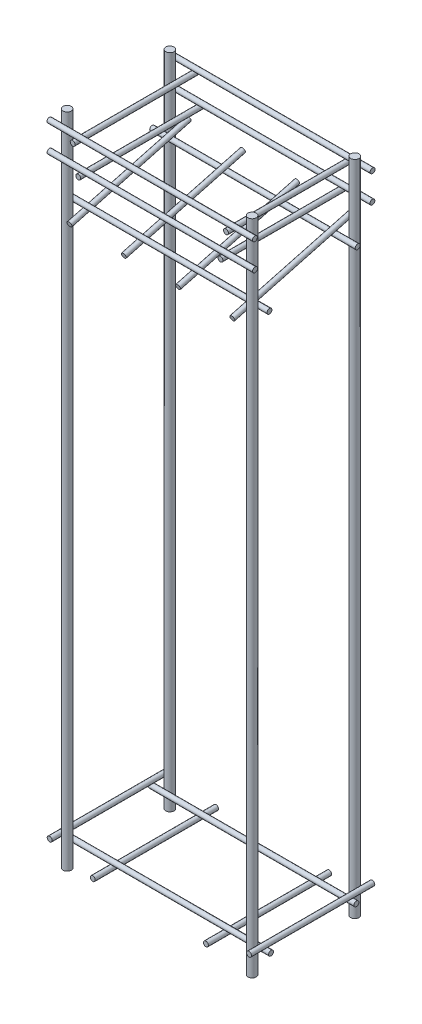
ISO-10303-21;
HEADER;
FILE_DESCRIPTION(('STEP AP214'),'2;1');
FILE_NAME('part.step','',(''),(''),'','','');
FILE_SCHEMA(('AUTOMOTIVE_DESIGN { 1 0 10303 214 1 1 1 1 }'));
ENDSEC;
DATA;
#1=APPLICATION_CONTEXT('core data for automotive mechanical design processes');
#2=APPLICATION_PROTOCOL_DEFINITION('international standard','automotive_design',2000,#1);
#3=PRODUCT_CONTEXT('',#1,'mechanical');
#4=PRODUCT('Part','Part','',(#3));
#5=PRODUCT_RELATED_PRODUCT_CATEGORY('part','',(#4));
#6=PRODUCT_DEFINITION_FORMATION('','',#4);
#7=PRODUCT_DEFINITION_CONTEXT('part definition',#1,'design');
#8=PRODUCT_DEFINITION('design','',#6,#7);
#9=PRODUCT_DEFINITION_SHAPE('','',#8);
#10=(LENGTH_UNIT() NAMED_UNIT(*) SI_UNIT(.MILLI.,.METRE.));
#11=(NAMED_UNIT(*) PLANE_ANGLE_UNIT() SI_UNIT($,.RADIAN.));
#12=(NAMED_UNIT(*) SI_UNIT($,.STERADIAN.) SOLID_ANGLE_UNIT());
#13=UNCERTAINTY_MEASURE_WITH_UNIT(LENGTH_MEASURE(1.E-05),#10,'distance_accuracy_value','');
#14=(GEOMETRIC_REPRESENTATION_CONTEXT(3) GLOBAL_UNCERTAINTY_ASSIGNED_CONTEXT((#13)) GLOBAL_UNIT_ASSIGNED_CONTEXT((#10,
#11,#12)) REPRESENTATION_CONTEXT('',''));
#15=CARTESIAN_POINT('',(0.,0.,0.));
#16=DIRECTION('',(0.,0.,1.));
#17=DIRECTION('',(1.,0.,0.));
#18=AXIS2_PLACEMENT_3D('',#15,#16,#17);
#19=CARTESIAN_POINT('',(196.,1378.33156675164,144.117162802677));
#20=DIRECTION('',(0.,-0.258819045102522,0.965925826289068));
#21=DIRECTION('',(0.,-0.965925826289068,-0.258819045102522));
#22=AXIS2_PLACEMENT_3D('',#19,#20,#21);
#23=PLANE('',#22);
#24=CARTESIAN_POINT('',(196.,1378.33156675164,144.117162802677));
#25=DIRECTION('',(0.,0.258819045102522,-0.965925826289068));
#26=DIRECTION('',(0.,0.965925826289068,0.258819045102522));
#27=AXIS2_PLACEMENT_3D('',#24,#25,#26);
#28=CIRCLE('',#27,6.00000000000024);
#29=CARTESIAN_POINT('',(196.,1384.12712170938,145.670077073292));
#30=VERTEX_POINT('',#29);
#31=EDGE_CURVE('E11',#30,#30,#28,.T.);
#32=ORIENTED_EDGE('',*,*,#31,.F.);
#33=EDGE_LOOP('',(#32));
#34=FACE_BOUND('',#33,.T.);
#35=ADVANCED_FACE('F48',(#34),#23,.T.);
#36=CARTESIAN_POINT('',(196.,1455.9772802824,-145.660585084044));
#37=DIRECTION('',(0.,0.258819045102522,-0.965925826289068));
#38=DIRECTION('',(0.,0.965925826289068,0.258819045102522));
#39=AXIS2_PLACEMENT_3D('',#36,#37,#38);
#40=CYLINDRICAL_SURFACE('',#39,6.00000000000012);
#41=ORIENTED_EDGE('',*,*,#31,.T.);
#42=EDGE_LOOP('',(#41));
#43=FACE_BOUND('',#42,.T.);
#44=CARTESIAN_POINT('',(196.,1455.9772802824,-145.660585084044));
#45=DIRECTION('',(0.,0.258819045102522,-0.965925826289068));
#46=DIRECTION('',(0.,0.965925826289068,0.258819045102522));
#47=AXIS2_PLACEMENT_3D('',#44,#45,#46);
#48=CIRCLE('',#47,6.00000000000004);
#49=CARTESIAN_POINT('',(196.,1461.77283524014,-144.107670813428));
#50=VERTEX_POINT('',#49);
#51=EDGE_CURVE('E54',#50,#50,#48,.T.);
#52=ORIENTED_EDGE('',*,*,#51,.F.);
#53=EDGE_LOOP('',(#52));
#54=FACE_BOUND('',#53,.T.);
#55=ADVANCED_FACE('F62',(#43,#54),#40,.T.);
#56=CARTESIAN_POINT('',(196.,1455.9772802824,-145.660585084044));
#57=DIRECTION('',(0.,0.258819045102522,-0.965925826289068));
#58=DIRECTION('',(0.,0.965925826289068,0.258819045102522));
#59=AXIS2_PLACEMENT_3D('',#56,#57,#58);
#60=PLANE('',#59);
#61=ORIENTED_EDGE('',*,*,#51,.T.);
#62=EDGE_LOOP('',(#61));
#63=FACE_BOUND('',#62,.T.);
#64=ADVANCED_FACE('F60',(#63),#60,.T.);
#65=CLOSED_SHELL('',(#35,#55,#64));
#66=MANIFOLD_SOLID_BREP('B2',#65);
#67=CARTESIAN_POINT('',(64.0000000000001,1378.33156675164,144.117162802677));
#68=DIRECTION('',(0.,-0.258819045102522,0.965925826289068));
#69=DIRECTION('',(0.,-0.965925826289068,-0.258819045102522));
#70=AXIS2_PLACEMENT_3D('',#67,#68,#69);
#71=PLANE('',#70);
#72=CARTESIAN_POINT('',(64.0000000000001,1378.33156675164,144.117162802677));
#73=DIRECTION('',(0.,0.258819045102522,-0.965925826289068));
#74=DIRECTION('',(0.,0.965925826289068,0.258819045102522));
#75=AXIS2_PLACEMENT_3D('',#72,#73,#74);
#76=CIRCLE('',#75,6.00000000000024);
#77=CARTESIAN_POINT('',(64.0000000000001,1384.12712170938,145.670077073292));
#78=VERTEX_POINT('',#77);
#79=EDGE_CURVE('E47',#78,#78,#76,.T.);
#80=ORIENTED_EDGE('',*,*,#79,.F.);
#81=EDGE_LOOP('',(#80));
#82=FACE_BOUND('',#81,.T.);
#83=ADVANCED_FACE('F97',(#82),#71,.T.);
#84=CARTESIAN_POINT('',(64.0000000000001,1455.9772802824,-145.660585084044));
#85=DIRECTION('',(0.,0.258819045102522,-0.965925826289068));
#86=DIRECTION('',(0.,0.965925826289068,0.258819045102522));
#87=AXIS2_PLACEMENT_3D('',#84,#85,#86);
#88=CYLINDRICAL_SURFACE('',#87,6.00000000000012);
#89=ORIENTED_EDGE('',*,*,#79,.T.);
#90=EDGE_LOOP('',(#89));
#91=FACE_BOUND('',#90,.T.);
#92=CARTESIAN_POINT('',(64.0000000000001,1455.9772802824,-145.660585084044));
#93=DIRECTION('',(0.,0.258819045102522,-0.965925826289068));
#94=DIRECTION('',(0.,0.965925826289068,0.258819045102522));
#95=AXIS2_PLACEMENT_3D('',#92,#93,#94);
#96=CIRCLE('',#95,6.00000000000004);
#97=CARTESIAN_POINT('',(64.0000000000001,1461.77283524014,-144.107670813428));
#98=VERTEX_POINT('',#97);
#99=EDGE_CURVE('E103',#98,#98,#96,.T.);
#100=ORIENTED_EDGE('',*,*,#99,.F.);
#101=EDGE_LOOP('',(#100));
#102=FACE_BOUND('',#101,.T.);
#103=ADVANCED_FACE('F111',(#91,#102),#88,.T.);
#104=CARTESIAN_POINT('',(64.0000000000001,1455.9772802824,-145.660585084044));
#105=DIRECTION('',(0.,0.258819045102522,-0.965925826289068));
#106=DIRECTION('',(0.,0.965925826289068,0.258819045102522));
#107=AXIS2_PLACEMENT_3D('',#104,#105,#106);
#108=PLANE('',#107);
#109=ORIENTED_EDGE('',*,*,#99,.T.);
#110=EDGE_LOOP('',(#109));
#111=FACE_BOUND('',#110,.T.);
#112=ADVANCED_FACE('F109',(#111),#108,.T.);
#113=CLOSED_SHELL('',(#83,#103,#112));
#114=MANIFOLD_SOLID_BREP('B6',#113);
#115=CARTESIAN_POINT('',(-67.9999999999999,1378.33156675164,144.117162802677));
#116=DIRECTION('',(0.,-0.258819045102522,0.965925826289068));
#117=DIRECTION('',(0.,-0.965925826289068,-0.258819045102522));
#118=AXIS2_PLACEMENT_3D('',#115,#116,#117);
#119=PLANE('',#118);
#120=CARTESIAN_POINT('',(-67.9999999999999,1378.33156675164,144.117162802677));
#121=DIRECTION('',(0.,0.258819045102522,-0.965925826289068));
#122=DIRECTION('',(0.,0.965925826289068,0.258819045102522));
#123=AXIS2_PLACEMENT_3D('',#120,#121,#122);
#124=CIRCLE('',#123,6.00000000000024);
#125=CARTESIAN_POINT('',(-67.9999999999999,1384.12712170938,145.670077073292));
#126=VERTEX_POINT('',#125);
#127=EDGE_CURVE('E96',#126,#126,#124,.T.);
#128=ORIENTED_EDGE('',*,*,#127,.F.);
#129=EDGE_LOOP('',(#128));
#130=FACE_BOUND('',#129,.T.);
#131=ADVANCED_FACE('F146',(#130),#119,.T.);
#132=CARTESIAN_POINT('',(-67.9999999999999,1455.9772802824,-145.660585084044));
#133=DIRECTION('',(0.,0.258819045102522,-0.965925826289068));
#134=DIRECTION('',(0.,0.965925826289068,0.258819045102522));
#135=AXIS2_PLACEMENT_3D('',#132,#133,#134);
#136=CYLINDRICAL_SURFACE('',#135,6.00000000000012);
#137=ORIENTED_EDGE('',*,*,#127,.T.);
#138=EDGE_LOOP('',(#137));
#139=FACE_BOUND('',#138,.T.);
#140=CARTESIAN_POINT('',(-67.9999999999999,1455.9772802824,-145.660585084044));
#141=DIRECTION('',(0.,0.258819045102522,-0.965925826289068));
#142=DIRECTION('',(0.,0.965925826289068,0.258819045102522));
#143=AXIS2_PLACEMENT_3D('',#140,#141,#142);
#144=CIRCLE('',#143,6.00000000000004);
#145=CARTESIAN_POINT('',(-67.9999999999999,1461.77283524014,-144.107670813428));
#146=VERTEX_POINT('',#145);
#147=EDGE_CURVE('E152',#146,#146,#144,.T.);
#148=ORIENTED_EDGE('',*,*,#147,.F.);
#149=EDGE_LOOP('',(#148));
#150=FACE_BOUND('',#149,.T.);
#151=ADVANCED_FACE('F160',(#139,#150),#136,.T.);
#152=CARTESIAN_POINT('',(-67.9999999999999,1455.9772802824,-145.660585084044));
#153=DIRECTION('',(0.,0.258819045102522,-0.965925826289068));
#154=DIRECTION('',(0.,0.965925826289068,0.258819045102522));
#155=AXIS2_PLACEMENT_3D('',#152,#153,#154);
#156=PLANE('',#155);
#157=ORIENTED_EDGE('',*,*,#147,.T.);
#158=EDGE_LOOP('',(#157));
#159=FACE_BOUND('',#158,.T.);
#160=ADVANCED_FACE('F158',(#159),#156,.T.);
#161=CLOSED_SHELL('',(#131,#151,#160));
#162=MANIFOLD_SOLID_BREP('B42',#161);
#163=CARTESIAN_POINT('',(-200.,1378.33156675164,144.117162802677));
#164=DIRECTION('',(0.,-0.258819045102522,0.965925826289068));
#165=DIRECTION('',(0.,-0.965925826289068,-0.258819045102522));
#166=AXIS2_PLACEMENT_3D('',#163,#164,#165);
#167=PLANE('',#166);
#168=CARTESIAN_POINT('',(-200.,1378.33156675164,144.117162802677));
#169=DIRECTION('',(0.,0.258819045102522,-0.965925826289068));
#170=DIRECTION('',(0.,0.965925826289068,0.258819045102522));
#171=AXIS2_PLACEMENT_3D('',#168,#169,#170);
#172=CIRCLE('',#171,6.00000000000024);
#173=CARTESIAN_POINT('',(-200.,1384.12712170938,145.670077073292));
#174=VERTEX_POINT('',#173);
#175=EDGE_CURVE('E201',#174,#174,#172,.T.);
#176=ORIENTED_EDGE('',*,*,#175,.F.);
#177=EDGE_LOOP('',(#176));
#178=FACE_BOUND('',#177,.T.);
#179=ADVANCED_FACE('F195',(#178),#167,.T.);
#180=CARTESIAN_POINT('',(-200.,1455.9772802824,-145.660585084044));
#181=DIRECTION('',(0.,0.258819045102522,-0.965925826289068));
#182=DIRECTION('',(0.,0.965925826289068,0.258819045102522));
#183=AXIS2_PLACEMENT_3D('',#180,#181,#182);
#184=PLANE('',#183);
#185=CARTESIAN_POINT('',(-200.,1455.9772802824,-145.660585084044));
#186=DIRECTION('',(0.,0.258819045102522,-0.965925826289068));
#187=DIRECTION('',(0.,0.965925826289068,0.258819045102522));
#188=AXIS2_PLACEMENT_3D('',#185,#186,#187);
#189=CIRCLE('',#188,6.00000000000004);
#190=CARTESIAN_POINT('',(-200.,1461.77283524014,-144.107670813428));
#191=VERTEX_POINT('',#190);
#192=EDGE_CURVE('E145',#191,#191,#189,.T.);
#193=ORIENTED_EDGE('',*,*,#192,.T.);
#194=EDGE_LOOP('',(#193));
#195=FACE_BOUND('',#194,.T.);
#196=ADVANCED_FACE('F211',(#195),#184,.T.);
#197=CARTESIAN_POINT('',(-200.,1455.9772802824,-145.660585084044));
#198=DIRECTION('',(0.,0.258819045102522,-0.965925826289068));
#199=DIRECTION('',(0.,0.965925826289068,0.258819045102522));
#200=AXIS2_PLACEMENT_3D('',#197,#198,#199);
#201=CYLINDRICAL_SURFACE('',#200,6.00000000000012);
#202=ORIENTED_EDGE('',*,*,#175,.T.);
#203=EDGE_LOOP('',(#202));
#204=FACE_BOUND('',#203,.T.);
#205=ORIENTED_EDGE('',*,*,#192,.F.);
#206=EDGE_LOOP('',(#205));
#207=FACE_BOUND('',#206,.T.);
#208=ADVANCED_FACE('F207',(#204,#207),#201,.T.);
#209=CLOSED_SHELL('',(#179,#196,#208));
#210=MANIFOLD_SOLID_BREP('B91',#209);
#211=CARTESIAN_POINT('',(250.,1430.5071877385,-106.955510048629));
#212=DIRECTION('',(-1.,0.,0.));
#213=DIRECTION('',(0.,0.,1.));
#214=AXIS2_PLACEMENT_3D('',#211,#212,#213);
#215=CYLINDRICAL_SURFACE('',#214,6.);
#216=CARTESIAN_POINT('',(250.,1430.5071877385,-106.955510048629));
#217=DIRECTION('',(1.,0.,0.));
#218=DIRECTION('',(0.,0.,1.));
#219=AXIS2_PLACEMENT_3D('',#216,#217,#218);
#220=CIRCLE('',#219,6.);
#221=CARTESIAN_POINT('',(250.,1430.5071877385,-100.955510048629));
#222=VERTEX_POINT('',#221);
#223=EDGE_CURVE('E248',#222,#222,#220,.T.);
#224=ORIENTED_EDGE('',*,*,#223,.F.);
#225=EDGE_LOOP('',(#224));
#226=FACE_BOUND('',#225,.T.);
#227=CARTESIAN_POINT('',(-250.,1430.5071877385,-106.955510048629));
#228=DIRECTION('',(1.,0.,0.));
#229=DIRECTION('',(0.,0.,1.));
#230=AXIS2_PLACEMENT_3D('',#227,#228,#229);
#231=CIRCLE('',#230,6.);
#232=CARTESIAN_POINT('',(-250.,1430.5071877385,-100.955510048629));
#233=VERTEX_POINT('',#232);
#234=EDGE_CURVE('E194',#233,#233,#231,.T.);
#235=ORIENTED_EDGE('',*,*,#234,.T.);
#236=EDGE_LOOP('',(#235));
#237=FACE_BOUND('',#236,.T.);
#238=ADVANCED_FACE('F244',(#226,#237),#215,.T.);
#239=CARTESIAN_POINT('',(250.,1430.5071877385,-106.955510048629));
#240=DIRECTION('',(-1.,0.,0.));
#241=DIRECTION('',(0.,0.,1.));
#242=AXIS2_PLACEMENT_3D('',#239,#240,#241);
#243=PLANE('',#242);
#244=ORIENTED_EDGE('',*,*,#223,.T.);
#245=EDGE_LOOP('',(#244));
#246=FACE_BOUND('',#245,.T.);
#247=ADVANCED_FACE('F246',(#246),#243,.F.);
#248=CARTESIAN_POINT('',(-250.,1430.5071877385,-106.955510048629));
#249=DIRECTION('',(-1.,0.,0.));
#250=DIRECTION('',(0.,0.,1.));
#251=AXIS2_PLACEMENT_3D('',#248,#249,#250);
#252=PLANE('',#251);
#253=ORIENTED_EDGE('',*,*,#234,.F.);
#254=EDGE_LOOP('',(#253));
#255=FACE_BOUND('',#254,.T.);
#256=ADVANCED_FACE('F263',(#255),#252,.T.);
#257=CLOSED_SHELL('',(#238,#247,#256));
#258=MANIFOLD_SOLID_BREP('B140',#257);
#259=CARTESIAN_POINT('',(250.,1401.92530520379,107.657826454038));
#260=DIRECTION('',(-1.,0.,0.));
#261=DIRECTION('',(0.,0.,1.));
#262=AXIS2_PLACEMENT_3D('',#259,#260,#261);
#263=CYLINDRICAL_SURFACE('',#262,6.);
#264=CARTESIAN_POINT('',(250.,1401.92530520379,107.657826454038));
#265=DIRECTION('',(1.,0.,0.));
#266=DIRECTION('',(0.,0.,-1.));
#267=AXIS2_PLACEMENT_3D('',#264,#265,#266);
#268=CIRCLE('',#267,6.);
#269=CARTESIAN_POINT('',(250.,1401.92530520379,101.657826454038));
#270=VERTEX_POINT('',#269);
#271=EDGE_CURVE('E243',#270,#270,#268,.T.);
#272=ORIENTED_EDGE('',*,*,#271,.F.);
#273=EDGE_LOOP('',(#272));
#274=FACE_BOUND('',#273,.T.);
#275=CARTESIAN_POINT('',(-250.,1401.92530520379,107.657826454038));
#276=DIRECTION('',(1.,0.,0.));
#277=DIRECTION('',(0.,0.,-1.));
#278=AXIS2_PLACEMENT_3D('',#275,#276,#277);
#279=CIRCLE('',#278,6.);
#280=CARTESIAN_POINT('',(-250.,1401.92530520379,101.657826454038));
#281=VERTEX_POINT('',#280);
#282=EDGE_CURVE('E296',#281,#281,#279,.T.);
#283=ORIENTED_EDGE('',*,*,#282,.T.);
#284=EDGE_LOOP('',(#283));
#285=FACE_BOUND('',#284,.T.);
#286=ADVANCED_FACE('F293',(#274,#285),#263,.T.);
#287=CARTESIAN_POINT('',(250.,1401.92530520379,107.657826454038));
#288=DIRECTION('',(1.,0.,0.));
#289=DIRECTION('',(0.,0.,-1.));
#290=AXIS2_PLACEMENT_3D('',#287,#288,#289);
#291=PLANE('',#290);
#292=ORIENTED_EDGE('',*,*,#271,.T.);
#293=EDGE_LOOP('',(#292));
#294=FACE_BOUND('',#293,.T.);
#295=ADVANCED_FACE('F308',(#294),#291,.T.);
#296=CARTESIAN_POINT('',(-250.,1401.92530520379,107.657826454038));
#297=DIRECTION('',(1.,0.,0.));
#298=DIRECTION('',(0.,0.,-1.));
#299=AXIS2_PLACEMENT_3D('',#296,#297,#298);
#300=PLANE('',#299);
#301=ORIENTED_EDGE('',*,*,#282,.F.);
#302=EDGE_LOOP('',(#301));
#303=FACE_BOUND('',#302,.T.);
#304=ADVANCED_FACE('F306',(#303),#300,.F.);
#305=CLOSED_SHELL('',(#286,#295,#304));
#306=MANIFOLD_SOLID_BREP('B189',#305);
#307=CARTESIAN_POINT('',(173.,1494.54464611904,150.));
#308=DIRECTION('',(0.,0.,-1.));
#309=DIRECTION('',(-1.,0.,0.));
#310=AXIS2_PLACEMENT_3D('',#307,#308,#309);
#311=CYLINDRICAL_SURFACE('',#310,6.00000000000002);
#312=CARTESIAN_POINT('',(173.,1494.54464611904,150.));
#313=DIRECTION('',(0.,0.,1.));
#314=DIRECTION('',(-1.,0.,0.));
#315=AXIS2_PLACEMENT_3D('',#312,#313,#314);
#316=CIRCLE('',#315,6.00000000000002);
#317=CARTESIAN_POINT('',(167.,1494.54464611904,150.));
#318=VERTEX_POINT('',#317);
#319=EDGE_CURVE('E346',#318,#318,#316,.T.);
#320=ORIENTED_EDGE('',*,*,#319,.F.);
#321=EDGE_LOOP('',(#320));
#322=FACE_BOUND('',#321,.T.);
#323=CARTESIAN_POINT('',(173.,1494.54464611904,-150.));
#324=DIRECTION('',(0.,0.,1.));
#325=DIRECTION('',(-1.,0.,0.));
#326=AXIS2_PLACEMENT_3D('',#323,#324,#325);
#327=CIRCLE('',#326,6.00000000000002);
#328=CARTESIAN_POINT('',(167.,1494.54464611904,-150.));
#329=VERTEX_POINT('',#328);
#330=EDGE_CURVE('E292',#329,#329,#327,.T.);
#331=ORIENTED_EDGE('',*,*,#330,.T.);
#332=EDGE_LOOP('',(#331));
#333=FACE_BOUND('',#332,.T.);
#334=ADVANCED_FACE('F342',(#322,#333),#311,.T.);
#335=CARTESIAN_POINT('',(173.,1494.54464611904,150.));
#336=DIRECTION('',(0.,0.,-1.));
#337=DIRECTION('',(-1.,0.,0.));
#338=AXIS2_PLACEMENT_3D('',#335,#336,#337);
#339=PLANE('',#338);
#340=ORIENTED_EDGE('',*,*,#319,.T.);
#341=EDGE_LOOP('',(#340));
#342=FACE_BOUND('',#341,.T.);
#343=ADVANCED_FACE('F344',(#342),#339,.F.);
#344=CARTESIAN_POINT('',(173.,1494.54464611904,-150.));
#345=DIRECTION('',(0.,0.,-1.));
#346=DIRECTION('',(-1.,0.,0.));
#347=AXIS2_PLACEMENT_3D('',#344,#345,#346);
#348=PLANE('',#347);
#349=ORIENTED_EDGE('',*,*,#330,.F.);
#350=EDGE_LOOP('',(#349));
#351=FACE_BOUND('',#350,.T.);
#352=ADVANCED_FACE('F361',(#351),#348,.T.);
#353=CLOSED_SHELL('',(#334,#343,#352));
#354=MANIFOLD_SOLID_BREP('B238',#353);
#355=CARTESIAN_POINT('',(-173.,1494.54464611904,150.));
#356=DIRECTION('',(0.,0.,-1.));
#357=DIRECTION('',(-1.,0.,0.));
#358=AXIS2_PLACEMENT_3D('',#355,#356,#357);
#359=CYLINDRICAL_SURFACE('',#358,6.00000000000002);
#360=CARTESIAN_POINT('',(-173.,1494.54464611904,150.));
#361=DIRECTION('',(0.,0.,1.));
#362=DIRECTION('',(1.,0.,0.));
#363=AXIS2_PLACEMENT_3D('',#360,#361,#362);
#364=CIRCLE('',#363,6.00000000000002);
#365=CARTESIAN_POINT('',(-167.,1494.54464611904,150.));
#366=VERTEX_POINT('',#365);
#367=EDGE_CURVE('E341',#366,#366,#364,.T.);
#368=ORIENTED_EDGE('',*,*,#367,.F.);
#369=EDGE_LOOP('',(#368));
#370=FACE_BOUND('',#369,.T.);
#371=CARTESIAN_POINT('',(-173.,1494.54464611904,-150.));
#372=DIRECTION('',(0.,0.,1.));
#373=DIRECTION('',(1.,0.,0.));
#374=AXIS2_PLACEMENT_3D('',#371,#372,#373);
#375=CIRCLE('',#374,6.00000000000002);
#376=CARTESIAN_POINT('',(-167.,1494.54464611904,-150.));
#377=VERTEX_POINT('',#376);
#378=EDGE_CURVE('E394',#377,#377,#375,.T.);
#379=ORIENTED_EDGE('',*,*,#378,.T.);
#380=EDGE_LOOP('',(#379));
#381=FACE_BOUND('',#380,.T.);
#382=ADVANCED_FACE('F391',(#370,#381),#359,.T.);
#383=CARTESIAN_POINT('',(-173.,1494.54464611904,150.));
#384=DIRECTION('',(0.,0.,1.));
#385=DIRECTION('',(1.,0.,0.));
#386=AXIS2_PLACEMENT_3D('',#383,#384,#385);
#387=PLANE('',#386);
#388=ORIENTED_EDGE('',*,*,#367,.T.);
#389=EDGE_LOOP('',(#388));
#390=FACE_BOUND('',#389,.T.);
#391=ADVANCED_FACE('F406',(#390),#387,.T.);
#392=CARTESIAN_POINT('',(-173.,1494.54464611904,-150.));
#393=DIRECTION('',(0.,0.,1.));
#394=DIRECTION('',(1.,0.,0.));
#395=AXIS2_PLACEMENT_3D('',#392,#393,#394);
#396=PLANE('',#395);
#397=ORIENTED_EDGE('',*,*,#378,.F.);
#398=EDGE_LOOP('',(#397));
#399=FACE_BOUND('',#398,.T.);
#400=ADVANCED_FACE('F404',(#399),#396,.F.);
#401=CLOSED_SHELL('',(#382,#391,#400));
#402=MANIFOLD_SOLID_BREP('B287',#401);
#403=CARTESIAN_POINT('',(250.,1506.80892711628,-142.693020426577));
#404=DIRECTION('',(-1.,0.,0.));
#405=DIRECTION('',(0.,0.,1.));
#406=AXIS2_PLACEMENT_3D('',#403,#404,#405);
#407=CYLINDRICAL_SURFACE('',#406,6.00000000000002);
#408=CARTESIAN_POINT('',(250.,1506.80892711628,-142.693020426577));
#409=DIRECTION('',(1.,0.,0.));
#410=DIRECTION('',(0.,0.,1.));
#411=AXIS2_PLACEMENT_3D('',#408,#409,#410);
#412=CIRCLE('',#411,6.00000000000002);
#413=CARTESIAN_POINT('',(250.,1506.80892711628,-136.693020426577));
#414=VERTEX_POINT('',#413);
#415=EDGE_CURVE('E444',#414,#414,#412,.T.);
#416=ORIENTED_EDGE('',*,*,#415,.F.);
#417=EDGE_LOOP('',(#416));
#418=FACE_BOUND('',#417,.T.);
#419=CARTESIAN_POINT('',(-250.,1506.80892711628,-142.693020426577));
#420=DIRECTION('',(1.,0.,0.));
#421=DIRECTION('',(0.,0.,1.));
#422=AXIS2_PLACEMENT_3D('',#419,#420,#421);
#423=CIRCLE('',#422,6.00000000000002);
#424=CARTESIAN_POINT('',(-250.,1506.80892711628,-136.693020426577));
#425=VERTEX_POINT('',#424);
#426=EDGE_CURVE('E390',#425,#425,#423,.T.);
#427=ORIENTED_EDGE('',*,*,#426,.T.);
#428=EDGE_LOOP('',(#427));
#429=FACE_BOUND('',#428,.T.);
#430=ADVANCED_FACE('F440',(#418,#429),#407,.T.);
#431=CARTESIAN_POINT('',(250.,1506.80892711628,-142.693020426577));
#432=DIRECTION('',(-1.,0.,0.));
#433=DIRECTION('',(0.,0.,1.));
#434=AXIS2_PLACEMENT_3D('',#431,#432,#433);
#435=PLANE('',#434);
#436=ORIENTED_EDGE('',*,*,#415,.T.);
#437=EDGE_LOOP('',(#436));
#438=FACE_BOUND('',#437,.T.);
#439=ADVANCED_FACE('F442',(#438),#435,.F.);
#440=CARTESIAN_POINT('',(-250.,1506.80892711628,-142.693020426577));
#441=DIRECTION('',(-1.,0.,0.));
#442=DIRECTION('',(0.,0.,1.));
#443=AXIS2_PLACEMENT_3D('',#440,#441,#442);
#444=PLANE('',#443);
#445=ORIENTED_EDGE('',*,*,#426,.F.);
#446=EDGE_LOOP('',(#445));
#447=FACE_BOUND('',#446,.T.);
#448=ADVANCED_FACE('F459',(#447),#444,.T.);
#449=CLOSED_SHELL('',(#430,#439,#448));
#450=MANIFOLD_SOLID_BREP('B336',#449);
#451=CARTESIAN_POINT('',(250.,1506.80892711628,142.693020426577));
#452=DIRECTION('',(-1.,0.,0.));
#453=DIRECTION('',(0.,0.,1.));
#454=AXIS2_PLACEMENT_3D('',#451,#452,#453);
#455=CYLINDRICAL_SURFACE('',#454,6.00000000000002);
#456=CARTESIAN_POINT('',(250.,1506.80892711628,142.693020426577));
#457=DIRECTION('',(1.,0.,0.));
#458=DIRECTION('',(0.,0.,-1.));
#459=AXIS2_PLACEMENT_3D('',#456,#457,#458);
#460=CIRCLE('',#459,6.00000000000002);
#461=CARTESIAN_POINT('',(250.,1506.80892711628,136.693020426577));
#462=VERTEX_POINT('',#461);
#463=EDGE_CURVE('E439',#462,#462,#460,.T.);
#464=ORIENTED_EDGE('',*,*,#463,.F.);
#465=EDGE_LOOP('',(#464));
#466=FACE_BOUND('',#465,.T.);
#467=CARTESIAN_POINT('',(-250.,1506.80892711628,142.693020426577));
#468=DIRECTION('',(1.,0.,0.));
#469=DIRECTION('',(0.,0.,-1.));
#470=AXIS2_PLACEMENT_3D('',#467,#468,#469);
#471=CIRCLE('',#470,6.00000000000002);
#472=CARTESIAN_POINT('',(-250.,1506.80892711628,136.693020426577));
#473=VERTEX_POINT('',#472);
#474=EDGE_CURVE('E492',#473,#473,#471,.T.);
#475=ORIENTED_EDGE('',*,*,#474,.T.);
#476=EDGE_LOOP('',(#475));
#477=FACE_BOUND('',#476,.T.);
#478=ADVANCED_FACE('F489',(#466,#477),#455,.T.);
#479=CARTESIAN_POINT('',(250.,1506.80892711628,142.693020426577));
#480=DIRECTION('',(1.,0.,0.));
#481=DIRECTION('',(0.,0.,-1.));
#482=AXIS2_PLACEMENT_3D('',#479,#480,#481);
#483=PLANE('',#482);
#484=ORIENTED_EDGE('',*,*,#463,.T.);
#485=EDGE_LOOP('',(#484));
#486=FACE_BOUND('',#485,.T.);
#487=ADVANCED_FACE('F504',(#486),#483,.T.);
#488=CARTESIAN_POINT('',(-250.,1506.80892711628,142.693020426577));
#489=DIRECTION('',(1.,0.,0.));
#490=DIRECTION('',(0.,0.,-1.));
#491=AXIS2_PLACEMENT_3D('',#488,#489,#490);
#492=PLANE('',#491);
#493=ORIENTED_EDGE('',*,*,#474,.F.);
#494=EDGE_LOOP('',(#493));
#495=FACE_BOUND('',#494,.T.);
#496=ADVANCED_FACE('F502',(#495),#492,.F.);
#497=CLOSED_SHELL('',(#478,#487,#496));
#498=MANIFOLD_SOLID_BREP('B385',#497);
#499=CARTESIAN_POINT('',(186.5,1558.92083316628,150.));
#500=DIRECTION('',(0.,0.,-1.));
#501=DIRECTION('',(-1.,0.,0.));
#502=AXIS2_PLACEMENT_3D('',#499,#500,#501);
#503=CYLINDRICAL_SURFACE('',#502,6.00000000000002);
#504=CARTESIAN_POINT('',(186.5,1558.92083316628,150.));
#505=DIRECTION('',(0.,0.,1.));
#506=DIRECTION('',(-1.,0.,0.));
#507=AXIS2_PLACEMENT_3D('',#504,#505,#506);
#508=CIRCLE('',#507,6.00000000000002);
#509=CARTESIAN_POINT('',(180.5,1558.92083316628,150.));
#510=VERTEX_POINT('',#509);
#511=EDGE_CURVE('E542',#510,#510,#508,.T.);
#512=ORIENTED_EDGE('',*,*,#511,.F.);
#513=EDGE_LOOP('',(#512));
#514=FACE_BOUND('',#513,.T.);
#515=CARTESIAN_POINT('',(186.5,1558.92083316628,-150.));
#516=DIRECTION('',(0.,0.,1.));
#517=DIRECTION('',(-1.,0.,0.));
#518=AXIS2_PLACEMENT_3D('',#515,#516,#517);
#519=CIRCLE('',#518,6.00000000000002);
#520=CARTESIAN_POINT('',(180.5,1558.92083316628,-150.));
#521=VERTEX_POINT('',#520);
#522=EDGE_CURVE('E488',#521,#521,#519,.T.);
#523=ORIENTED_EDGE('',*,*,#522,.T.);
#524=EDGE_LOOP('',(#523));
#525=FACE_BOUND('',#524,.T.);
#526=ADVANCED_FACE('F538',(#514,#525),#503,.T.);
#527=CARTESIAN_POINT('',(186.5,1558.92083316628,150.));
#528=DIRECTION('',(0.,0.,-1.));
#529=DIRECTION('',(-1.,0.,0.));
#530=AXIS2_PLACEMENT_3D('',#527,#528,#529);
#531=PLANE('',#530);
#532=ORIENTED_EDGE('',*,*,#511,.T.);
#533=EDGE_LOOP('',(#532));
#534=FACE_BOUND('',#533,.T.);
#535=ADVANCED_FACE('F540',(#534),#531,.F.);
#536=CARTESIAN_POINT('',(186.5,1558.92083316628,-150.));
#537=DIRECTION('',(0.,0.,-1.));
#538=DIRECTION('',(-1.,0.,0.));
#539=AXIS2_PLACEMENT_3D('',#536,#537,#538);
#540=PLANE('',#539);
#541=ORIENTED_EDGE('',*,*,#522,.F.);
#542=EDGE_LOOP('',(#541));
#543=FACE_BOUND('',#542,.T.);
#544=ADVANCED_FACE('F557',(#543),#540,.T.);
#545=CLOSED_SHELL('',(#526,#535,#544));
#546=MANIFOLD_SOLID_BREP('B434_NOT_SHOWN',#545);
#547=CARTESIAN_POINT('',(-186.5,1558.92083316628,150.));
#548=DIRECTION('',(0.,0.,-1.));
#549=DIRECTION('',(-1.,0.,0.));
#550=AXIS2_PLACEMENT_3D('',#547,#548,#549);
#551=CYLINDRICAL_SURFACE('',#550,6.00000000000002);
#552=CARTESIAN_POINT('',(-186.5,1558.92083316628,150.));
#553=DIRECTION('',(0.,0.,1.));
#554=DIRECTION('',(1.,0.,0.));
#555=AXIS2_PLACEMENT_3D('',#552,#553,#554);
#556=CIRCLE('',#555,6.00000000000002);
#557=CARTESIAN_POINT('',(-180.5,1558.92083316628,150.));
#558=VERTEX_POINT('',#557);
#559=EDGE_CURVE('E537',#558,#558,#556,.T.);
#560=ORIENTED_EDGE('',*,*,#559,.F.);
#561=EDGE_LOOP('',(#560));
#562=FACE_BOUND('',#561,.T.);
#563=CARTESIAN_POINT('',(-186.5,1558.92083316628,-150.));
#564=DIRECTION('',(0.,0.,1.));
#565=DIRECTION('',(1.,0.,0.));
#566=AXIS2_PLACEMENT_3D('',#563,#564,#565);
#567=CIRCLE('',#566,6.00000000000002);
#568=CARTESIAN_POINT('',(-180.5,1558.92083316628,-150.));
#569=VERTEX_POINT('',#568);
#570=EDGE_CURVE('E590',#569,#569,#567,.T.);
#571=ORIENTED_EDGE('',*,*,#570,.T.);
#572=EDGE_LOOP('',(#571));
#573=FACE_BOUND('',#572,.T.);
#574=ADVANCED_FACE('F587',(#562,#573),#551,.T.);
#575=CARTESIAN_POINT('',(-186.5,1558.92083316628,150.));
#576=DIRECTION('',(0.,0.,1.));
#577=DIRECTION('',(1.,0.,0.));
#578=AXIS2_PLACEMENT_3D('',#575,#576,#577);
#579=PLANE('',#578);
#580=ORIENTED_EDGE('',*,*,#559,.T.);
#581=EDGE_LOOP('',(#580));
#582=FACE_BOUND('',#581,.T.);
#583=ADVANCED_FACE('F602',(#582),#579,.T.);
#584=CARTESIAN_POINT('',(-186.5,1558.92083316628,-150.));
#585=DIRECTION('',(0.,0.,1.));
#586=DIRECTION('',(1.,0.,0.));
#587=AXIS2_PLACEMENT_3D('',#584,#585,#586);
#588=PLANE('',#587);
#589=ORIENTED_EDGE('',*,*,#570,.F.);
#590=EDGE_LOOP('',(#589));
#591=FACE_BOUND('',#590,.T.);
#592=ADVANCED_FACE('F600',(#591),#588,.F.);
#593=CLOSED_SHELL('',(#574,#583,#592));
#594=MANIFOLD_SOLID_BREP('B483_NOT_SHOWN',#593);
#595=CARTESIAN_POINT('',(250.,1572.5906360671,-143.159124669673));
#596=DIRECTION('',(-1.,0.,0.));
#597=DIRECTION('',(0.,0.,1.));
#598=AXIS2_PLACEMENT_3D('',#595,#596,#597);
#599=CYLINDRICAL_SURFACE('',#598,6.00000000000002);
#600=CARTESIAN_POINT('',(250.,1572.5906360671,-143.159124669673));
#601=DIRECTION('',(1.,0.,0.));
#602=DIRECTION('',(0.,0.,1.));
#603=AXIS2_PLACEMENT_3D('',#600,#601,#602);
#604=CIRCLE('',#603,6.00000000000002);
#605=CARTESIAN_POINT('',(250.,1572.5906360671,-137.159124669673));
#606=VERTEX_POINT('',#605);
#607=EDGE_CURVE('E640',#606,#606,#604,.T.);
#608=ORIENTED_EDGE('',*,*,#607,.F.);
#609=EDGE_LOOP('',(#608));
#610=FACE_BOUND('',#609,.T.);
#611=CARTESIAN_POINT('',(-250.,1572.5906360671,-143.159124669673));
#612=DIRECTION('',(1.,0.,0.));
#613=DIRECTION('',(0.,0.,1.));
#614=AXIS2_PLACEMENT_3D('',#611,#612,#613);
#615=CIRCLE('',#614,6.00000000000002);
#616=CARTESIAN_POINT('',(-250.,1572.5906360671,-137.159124669673));
#617=VERTEX_POINT('',#616);
#618=EDGE_CURVE('E586',#617,#617,#615,.T.);
#619=ORIENTED_EDGE('',*,*,#618,.T.);
#620=EDGE_LOOP('',(#619));
#621=FACE_BOUND('',#620,.T.);
#622=ADVANCED_FACE('F636',(#610,#621),#599,.T.);
#623=CARTESIAN_POINT('',(250.,1572.5906360671,-143.159124669673));
#624=DIRECTION('',(-1.,0.,0.));
#625=DIRECTION('',(0.,0.,1.));
#626=AXIS2_PLACEMENT_3D('',#623,#624,#625);
#627=PLANE('',#626);
#628=ORIENTED_EDGE('',*,*,#607,.T.);
#629=EDGE_LOOP('',(#628));
#630=FACE_BOUND('',#629,.T.);
#631=ADVANCED_FACE('F638',(#630),#627,.F.);
#632=CARTESIAN_POINT('',(-250.,1572.5906360671,-143.159124669673));
#633=DIRECTION('',(-1.,0.,0.));
#634=DIRECTION('',(0.,0.,1.));
#635=AXIS2_PLACEMENT_3D('',#632,#633,#634);
#636=PLANE('',#635);
#637=ORIENTED_EDGE('',*,*,#618,.F.);
#638=EDGE_LOOP('',(#637));
#639=FACE_BOUND('',#638,.T.);
#640=ADVANCED_FACE('F655',(#639),#636,.T.);
#641=CLOSED_SHELL('',(#622,#631,#640));
#642=MANIFOLD_SOLID_BREP('B532',#641);
#643=CARTESIAN_POINT('',(250.,1572.5906360671,143.086419347254));
#644=DIRECTION('',(-1.,0.,0.));
#645=DIRECTION('',(0.,0.,1.));
#646=AXIS2_PLACEMENT_3D('',#643,#644,#645);
#647=CYLINDRICAL_SURFACE('',#646,6.00000000000002);
#648=CARTESIAN_POINT('',(250.,1572.5906360671,143.086419347254));
#649=DIRECTION('',(1.,0.,0.));
#650=DIRECTION('',(0.,0.,-1.));
#651=AXIS2_PLACEMENT_3D('',#648,#649,#650);
#652=CIRCLE('',#651,6.00000000000002);
#653=CARTESIAN_POINT('',(250.,1572.5906360671,137.086419347254));
#654=VERTEX_POINT('',#653);
#655=EDGE_CURVE('E635',#654,#654,#652,.T.);
#656=ORIENTED_EDGE('',*,*,#655,.F.);
#657=EDGE_LOOP('',(#656));
#658=FACE_BOUND('',#657,.T.);
#659=CARTESIAN_POINT('',(-250.,1572.5906360671,143.086419347254));
#660=DIRECTION('',(1.,0.,0.));
#661=DIRECTION('',(0.,0.,-1.));
#662=AXIS2_PLACEMENT_3D('',#659,#660,#661);
#663=CIRCLE('',#662,6.00000000000002);
#664=CARTESIAN_POINT('',(-250.,1572.5906360671,137.086419347254));
#665=VERTEX_POINT('',#664);
#666=EDGE_CURVE('E688',#665,#665,#663,.T.);
#667=ORIENTED_EDGE('',*,*,#666,.T.);
#668=EDGE_LOOP('',(#667));
#669=FACE_BOUND('',#668,.T.);
#670=ADVANCED_FACE('F685',(#658,#669),#647,.T.);
#671=CARTESIAN_POINT('',(250.,1572.5906360671,143.086419347254));
#672=DIRECTION('',(1.,0.,0.));
#673=DIRECTION('',(0.,0.,-1.));
#674=AXIS2_PLACEMENT_3D('',#671,#672,#673);
#675=PLANE('',#674);
#676=ORIENTED_EDGE('',*,*,#655,.T.);
#677=EDGE_LOOP('',(#676));
#678=FACE_BOUND('',#677,.T.);
#679=ADVANCED_FACE('F700',(#678),#675,.T.);
#680=CARTESIAN_POINT('',(-250.,1572.5906360671,143.086419347254));
#681=DIRECTION('',(1.,0.,0.));
#682=DIRECTION('',(0.,0.,-1.));
#683=AXIS2_PLACEMENT_3D('',#680,#681,#682);
#684=PLANE('',#683);
#685=ORIENTED_EDGE('',*,*,#666,.F.);
#686=EDGE_LOOP('',(#685));
#687=FACE_BOUND('',#686,.T.);
#688=ADVANCED_FACE('F698',(#687),#684,.F.);
#689=CLOSED_SHELL('',(#670,#679,#688));
#690=MANIFOLD_SOLID_BREP('B581',#689);
#691=CARTESIAN_POINT('',(250.,47.3546977990313,-103.90350312241));
#692=DIRECTION('',(-1.,0.,0.));
#693=DIRECTION('',(0.,0.,1.));
#694=AXIS2_PLACEMENT_3D('',#691,#692,#693);
#695=CYLINDRICAL_SURFACE('',#694,6.);
#696=CARTESIAN_POINT('',(250.,47.3546977990313,-103.90350312241));
#697=DIRECTION('',(1.,0.,0.));
#698=DIRECTION('',(0.,0.,1.));
#699=AXIS2_PLACEMENT_3D('',#696,#697,#698);
#700=CIRCLE('',#699,6.);
#701=CARTESIAN_POINT('',(250.,47.3546977990313,-97.9035031224103));
#702=VERTEX_POINT('',#701);
#703=EDGE_CURVE('E738',#702,#702,#700,.T.);
#704=ORIENTED_EDGE('',*,*,#703,.F.);
#705=EDGE_LOOP('',(#704));
#706=FACE_BOUND('',#705,.T.);
#707=CARTESIAN_POINT('',(-250.,47.3546977990313,-103.90350312241));
#708=DIRECTION('',(1.,0.,0.));
#709=DIRECTION('',(0.,0.,1.));
#710=AXIS2_PLACEMENT_3D('',#707,#708,#709);
#711=CIRCLE('',#710,6.);
#712=CARTESIAN_POINT('',(-250.,47.3546977990313,-97.9035031224103));
#713=VERTEX_POINT('',#712);
#714=EDGE_CURVE('E684',#713,#713,#711,.T.);
#715=ORIENTED_EDGE('',*,*,#714,.T.);
#716=EDGE_LOOP('',(#715));
#717=FACE_BOUND('',#716,.T.);
#718=ADVANCED_FACE('F734',(#706,#717),#695,.T.);
#719=CARTESIAN_POINT('',(250.,47.3546977990313,-103.90350312241));
#720=DIRECTION('',(-1.,0.,0.));
#721=DIRECTION('',(0.,0.,1.));
#722=AXIS2_PLACEMENT_3D('',#719,#720,#721);
#723=PLANE('',#722);
#724=ORIENTED_EDGE('',*,*,#703,.T.);
#725=EDGE_LOOP('',(#724));
#726=FACE_BOUND('',#725,.T.);
#727=ADVANCED_FACE('F736',(#726),#723,.F.);
#728=CARTESIAN_POINT('',(-250.,47.3546977990313,-103.90350312241));
#729=DIRECTION('',(-1.,0.,0.));
#730=DIRECTION('',(0.,0.,1.));
#731=AXIS2_PLACEMENT_3D('',#728,#729,#730);
#732=PLANE('',#731);
#733=ORIENTED_EDGE('',*,*,#714,.F.);
#734=EDGE_LOOP('',(#733));
#735=FACE_BOUND('',#734,.T.);
#736=ADVANCED_FACE('F753',(#735),#732,.T.);
#737=CLOSED_SHELL('',(#718,#727,#736));
#738=MANIFOLD_SOLID_BREP('B630',#737);
#739=CARTESIAN_POINT('',(250.,47.3546977990313,103.90350312241));
#740=DIRECTION('',(-1.,0.,0.));
#741=DIRECTION('',(0.,0.,1.));
#742=AXIS2_PLACEMENT_3D('',#739,#740,#741);
#743=CYLINDRICAL_SURFACE('',#742,6.);
#744=CARTESIAN_POINT('',(250.,47.3546977990313,103.90350312241));
#745=DIRECTION('',(1.,0.,0.));
#746=DIRECTION('',(0.,0.,-1.));
#747=AXIS2_PLACEMENT_3D('',#744,#745,#746);
#748=CIRCLE('',#747,6.);
#749=CARTESIAN_POINT('',(250.,47.3546977990313,97.9035031224103));
#750=VERTEX_POINT('',#749);
#751=EDGE_CURVE('E733',#750,#750,#748,.T.);
#752=ORIENTED_EDGE('',*,*,#751,.F.);
#753=EDGE_LOOP('',(#752));
#754=FACE_BOUND('',#753,.T.);
#755=CARTESIAN_POINT('',(-250.,47.3546977990313,103.90350312241));
#756=DIRECTION('',(1.,0.,0.));
#757=DIRECTION('',(0.,0.,-1.));
#758=AXIS2_PLACEMENT_3D('',#755,#756,#757);
#759=CIRCLE('',#758,6.);
#760=CARTESIAN_POINT('',(-250.,47.3546977990313,97.9035031224103));
#761=VERTEX_POINT('',#760);
#762=EDGE_CURVE('E786',#761,#761,#759,.T.);
#763=ORIENTED_EDGE('',*,*,#762,.T.);
#764=EDGE_LOOP('',(#763));
#765=FACE_BOUND('',#764,.T.);
#766=ADVANCED_FACE('F783',(#754,#765),#743,.T.);
#767=CARTESIAN_POINT('',(250.,47.3546977990313,103.90350312241));
#768=DIRECTION('',(1.,0.,0.));
#769=DIRECTION('',(0.,0.,-1.));
#770=AXIS2_PLACEMENT_3D('',#767,#768,#769);
#771=PLANE('',#770);
#772=ORIENTED_EDGE('',*,*,#751,.T.);
#773=EDGE_LOOP('',(#772));
#774=FACE_BOUND('',#773,.T.);
#775=ADVANCED_FACE('F798',(#774),#771,.T.);
#776=CARTESIAN_POINT('',(-250.,47.3546977990313,103.90350312241));
#777=DIRECTION('',(1.,0.,0.));
#778=DIRECTION('',(0.,0.,-1.));
#779=AXIS2_PLACEMENT_3D('',#776,#777,#778);
#780=PLANE('',#779);
#781=ORIENTED_EDGE('',*,*,#762,.F.);
#782=EDGE_LOOP('',(#781));
#783=FACE_BOUND('',#782,.T.);
#784=ADVANCED_FACE('F796',(#783),#780,.F.);
#785=CLOSED_SHELL('',(#766,#775,#784));
#786=MANIFOLD_SOLID_BREP('B679',#785);
#787=CARTESIAN_POINT('',(-137.637701534255,33.6003812599677,150.));
#788=DIRECTION('',(0.,0.,-1.));
#789=DIRECTION('',(-1.,0.,0.));
#790=AXIS2_PLACEMENT_3D('',#787,#788,#789);
#791=CYLINDRICAL_SURFACE('',#790,6.00000000000002);
#792=CARTESIAN_POINT('',(-137.637701534255,33.6003812599677,150.));
#793=DIRECTION('',(0.,0.,1.));
#794=DIRECTION('',(1.,0.,0.));
#795=AXIS2_PLACEMENT_3D('',#792,#793,#794);
#796=CIRCLE('',#795,6.00000000000002);
#797=CARTESIAN_POINT('',(-131.637701534255,33.6003812599677,150.));
#798=VERTEX_POINT('',#797);
#799=EDGE_CURVE('E836',#798,#798,#796,.T.);
#800=ORIENTED_EDGE('',*,*,#799,.F.);
#801=EDGE_LOOP('',(#800));
#802=FACE_BOUND('',#801,.T.);
#803=CARTESIAN_POINT('',(-137.637701534255,33.6003812599677,-150.));
#804=DIRECTION('',(0.,0.,1.));
#805=DIRECTION('',(1.,0.,0.));
#806=AXIS2_PLACEMENT_3D('',#803,#804,#805);
#807=CIRCLE('',#806,6.00000000000002);
#808=CARTESIAN_POINT('',(-131.637701534255,33.6003812599677,-150.));
#809=VERTEX_POINT('',#808);
#810=EDGE_CURVE('E782',#809,#809,#807,.T.);
#811=ORIENTED_EDGE('',*,*,#810,.T.);
#812=EDGE_LOOP('',(#811));
#813=FACE_BOUND('',#812,.T.);
#814=ADVANCED_FACE('F832',(#802,#813),#791,.T.);
#815=CARTESIAN_POINT('',(-137.637701534255,33.6003812599677,150.));
#816=DIRECTION('',(0.,0.,1.));
#817=DIRECTION('',(1.,0.,0.));
#818=AXIS2_PLACEMENT_3D('',#815,#816,#817);
#819=PLANE('',#818);
#820=ORIENTED_EDGE('',*,*,#799,.T.);
#821=EDGE_LOOP('',(#820));
#822=FACE_BOUND('',#821,.T.);
#823=ADVANCED_FACE('F834',(#822),#819,.T.);
#824=CARTESIAN_POINT('',(-137.637701534255,33.6003812599677,-150.));
#825=DIRECTION('',(0.,0.,1.));
#826=DIRECTION('',(1.,0.,0.));
#827=AXIS2_PLACEMENT_3D('',#824,#825,#826);
#828=PLANE('',#827);
#829=ORIENTED_EDGE('',*,*,#810,.F.);
#830=EDGE_LOOP('',(#829));
#831=FACE_BOUND('',#830,.T.);
#832=ADVANCED_FACE('F851',(#831),#828,.F.);
#833=CLOSED_SHELL('',(#814,#823,#832));
#834=MANIFOLD_SOLID_BREP('B728',#833);
#835=CARTESIAN_POINT('',(242.529677983415,64.4202381534884,150.));
#836=DIRECTION('',(0.,0.,-1.));
#837=DIRECTION('',(-1.,0.,0.));
#838=AXIS2_PLACEMENT_3D('',#835,#836,#837);
#839=CYLINDRICAL_SURFACE('',#838,6.00000000000002);
#840=CARTESIAN_POINT('',(242.529677983415,64.4202381534884,150.));
#841=DIRECTION('',(0.,0.,1.));
#842=DIRECTION('',(-1.,0.,0.));
#843=AXIS2_PLACEMENT_3D('',#840,#841,#842);
#844=CIRCLE('',#843,6.00000000000002);
#845=CARTESIAN_POINT('',(236.529677983415,64.4202381534884,150.));
#846=VERTEX_POINT('',#845);
#847=EDGE_CURVE('E885',#846,#846,#844,.T.);
#848=ORIENTED_EDGE('',*,*,#847,.F.);
#849=EDGE_LOOP('',(#848));
#850=FACE_BOUND('',#849,.T.);
#851=CARTESIAN_POINT('',(242.529677983415,64.4202381534884,-150.));
#852=DIRECTION('',(0.,0.,1.));
#853=DIRECTION('',(-1.,0.,0.));
#854=AXIS2_PLACEMENT_3D('',#851,#852,#853);
#855=CIRCLE('',#854,6.00000000000002);
#856=CARTESIAN_POINT('',(236.529677983415,64.4202381534884,-150.));
#857=VERTEX_POINT('',#856);
#858=EDGE_CURVE('E831',#857,#857,#855,.T.);
#859=ORIENTED_EDGE('',*,*,#858,.T.);
#860=EDGE_LOOP('',(#859));
#861=FACE_BOUND('',#860,.T.);
#862=ADVANCED_FACE('F881',(#850,#861),#839,.T.);
#863=CARTESIAN_POINT('',(242.529677983415,64.4202381534884,150.));
#864=DIRECTION('',(0.,0.,-1.));
#865=DIRECTION('',(-1.,0.,0.));
#866=AXIS2_PLACEMENT_3D('',#863,#864,#865);
#867=PLANE('',#866);
#868=ORIENTED_EDGE('',*,*,#847,.T.);
#869=EDGE_LOOP('',(#868));
#870=FACE_BOUND('',#869,.T.);
#871=ADVANCED_FACE('F883',(#870),#867,.F.);
#872=CARTESIAN_POINT('',(242.529677983415,64.4202381534884,-150.));
#873=DIRECTION('',(0.,0.,-1.));
#874=DIRECTION('',(-1.,0.,0.));
#875=AXIS2_PLACEMENT_3D('',#872,#873,#874);
#876=PLANE('',#875);
#877=ORIENTED_EDGE('',*,*,#858,.F.);
#878=EDGE_LOOP('',(#877));
#879=FACE_BOUND('',#878,.T.);
#880=ADVANCED_FACE('F900',(#879),#876,.T.);
#881=CLOSED_SHELL('',(#862,#871,#880));
#882=MANIFOLD_SOLID_BREP('B777',#881);
#883=CARTESIAN_POINT('',(137.637701534255,33.6003812599677,150.));
#884=DIRECTION('',(0.,0.,-1.));
#885=DIRECTION('',(-1.,0.,0.));
#886=AXIS2_PLACEMENT_3D('',#883,#884,#885);
#887=CYLINDRICAL_SURFACE('',#886,6.00000000000002);
#888=CARTESIAN_POINT('',(137.637701534255,33.6003812599677,150.));
#889=DIRECTION('',(0.,0.,1.));
#890=DIRECTION('',(-1.,0.,0.));
#891=AXIS2_PLACEMENT_3D('',#888,#889,#890);
#892=CIRCLE('',#891,6.00000000000002);
#893=CARTESIAN_POINT('',(131.637701534255,33.6003812599677,150.));
#894=VERTEX_POINT('',#893);
#895=EDGE_CURVE('E934',#894,#894,#892,.T.);
#896=ORIENTED_EDGE('',*,*,#895,.F.);
#897=EDGE_LOOP('',(#896));
#898=FACE_BOUND('',#897,.T.);
#899=CARTESIAN_POINT('',(137.637701534255,33.6003812599677,-150.));
#900=DIRECTION('',(0.,0.,1.));
#901=DIRECTION('',(-1.,0.,0.));
#902=AXIS2_PLACEMENT_3D('',#899,#900,#901);
#903=CIRCLE('',#902,6.00000000000002);
#904=CARTESIAN_POINT('',(131.637701534255,33.6003812599677,-150.));
#905=VERTEX_POINT('',#904);
#906=EDGE_CURVE('E880',#905,#905,#903,.T.);
#907=ORIENTED_EDGE('',*,*,#906,.T.);
#908=EDGE_LOOP('',(#907));
#909=FACE_BOUND('',#908,.T.);
#910=ADVANCED_FACE('F930',(#898,#909),#887,.T.);
#911=CARTESIAN_POINT('',(137.637701534255,33.6003812599677,150.));
#912=DIRECTION('',(0.,0.,-1.));
#913=DIRECTION('',(-1.,0.,0.));
#914=AXIS2_PLACEMENT_3D('',#911,#912,#913);
#915=PLANE('',#914);
#916=ORIENTED_EDGE('',*,*,#895,.T.);
#917=EDGE_LOOP('',(#916));
#918=FACE_BOUND('',#917,.T.);
#919=ADVANCED_FACE('F932',(#918),#915,.F.);
#920=CARTESIAN_POINT('',(137.637701534255,33.6003812599677,-150.));
#921=DIRECTION('',(0.,0.,-1.));
#922=DIRECTION('',(-1.,0.,0.));
#923=AXIS2_PLACEMENT_3D('',#920,#921,#922);
#924=PLANE('',#923);
#925=ORIENTED_EDGE('',*,*,#906,.F.);
#926=EDGE_LOOP('',(#925));
#927=FACE_BOUND('',#926,.T.);
#928=ADVANCED_FACE('F949',(#927),#924,.T.);
#929=CLOSED_SHELL('',(#910,#919,#928));
#930=MANIFOLD_SOLID_BREP('B826',#929);
#931=CARTESIAN_POINT('',(-242.529677983415,64.4202381534884,150.));
#932=DIRECTION('',(0.,0.,-1.));
#933=DIRECTION('',(-1.,0.,0.));
#934=AXIS2_PLACEMENT_3D('',#931,#932,#933);
#935=CYLINDRICAL_SURFACE('',#934,6.00000000000002);
#936=CARTESIAN_POINT('',(-242.529677983415,64.4202381534884,150.));
#937=DIRECTION('',(0.,0.,1.));
#938=DIRECTION('',(1.,0.,0.));
#939=AXIS2_PLACEMENT_3D('',#936,#937,#938);
#940=CIRCLE('',#939,6.00000000000002);
#941=CARTESIAN_POINT('',(-236.529677983415,64.4202381534884,150.));
#942=VERTEX_POINT('',#941);
#943=EDGE_CURVE('E929',#942,#942,#940,.T.);
#944=ORIENTED_EDGE('',*,*,#943,.F.);
#945=EDGE_LOOP('',(#944));
#946=FACE_BOUND('',#945,.T.);
#947=CARTESIAN_POINT('',(-242.529677983415,64.4202381534884,-150.));
#948=DIRECTION('',(0.,0.,1.));
#949=DIRECTION('',(1.,0.,0.));
#950=AXIS2_PLACEMENT_3D('',#947,#948,#949);
#951=CIRCLE('',#950,6.00000000000002);
#952=CARTESIAN_POINT('',(-236.529677983415,64.4202381534884,-150.));
#953=VERTEX_POINT('',#952);
#954=EDGE_CURVE('E982',#953,#953,#951,.T.);
#955=ORIENTED_EDGE('',*,*,#954,.T.);
#956=EDGE_LOOP('',(#955));
#957=FACE_BOUND('',#956,.T.);
#958=ADVANCED_FACE('F979',(#946,#957),#935,.T.);
#959=CARTESIAN_POINT('',(-242.529677983415,64.4202381534884,150.));
#960=DIRECTION('',(0.,0.,1.));
#961=DIRECTION('',(1.,0.,0.));
#962=AXIS2_PLACEMENT_3D('',#959,#960,#961);
#963=PLANE('',#962);
#964=ORIENTED_EDGE('',*,*,#943,.T.);
#965=EDGE_LOOP('',(#964));
#966=FACE_BOUND('',#965,.T.);
#967=ADVANCED_FACE('F994',(#966),#963,.T.);
#968=CARTESIAN_POINT('',(-242.529677983415,64.4202381534884,-150.));
#969=DIRECTION('',(0.,0.,1.));
#970=DIRECTION('',(1.,0.,0.));
#971=AXIS2_PLACEMENT_3D('',#968,#969,#970);
#972=PLANE('',#971);
#973=ORIENTED_EDGE('',*,*,#954,.F.);
#974=EDGE_LOOP('',(#973));
#975=FACE_BOUND('',#974,.T.);
#976=ADVANCED_FACE('F992',(#975),#972,.F.);
#977=CLOSED_SHELL('',(#958,#967,#976));
#978=MANIFOLD_SOLID_BREP('B875',#977);
#979=CARTESIAN_POINT('',(-225.000000000001,1600.,-125.));
#980=DIRECTION('',(0.,-1.,0.));
#981=DIRECTION('',(0.,0.,-1.));
#982=AXIS2_PLACEMENT_3D('',#979,#980,#981);
#983=CYLINDRICAL_SURFACE('',#982,10.);
#984=CARTESIAN_POINT('',(-225.000000000001,1600.,-125.));
#985=DIRECTION('',(0.,1.,0.));
#986=DIRECTION('',(0.,0.,1.));
#987=AXIS2_PLACEMENT_3D('',#984,#985,#986);
#988=CIRCLE('',#987,10.);
#989=CARTESIAN_POINT('',(-225.000000000001,1600.,-115.));
#990=VERTEX_POINT('',#989);
#991=EDGE_CURVE('E1032',#990,#990,#988,.T.);
#992=ORIENTED_EDGE('',*,*,#991,.F.);
#993=EDGE_LOOP('',(#992));
#994=FACE_BOUND('',#993,.T.);
#995=CARTESIAN_POINT('',(-225.000000000001,0.,-125.));
#996=DIRECTION('',(0.,1.,0.));
#997=DIRECTION('',(0.,0.,1.));
#998=AXIS2_PLACEMENT_3D('',#995,#996,#997);
#999=CIRCLE('',#998,10.);
#1000=CARTESIAN_POINT('',(-225.000000000001,0.,-115.));
#1001=VERTEX_POINT('',#1000);
#1002=EDGE_CURVE('E978',#1001,#1001,#999,.T.);
#1003=ORIENTED_EDGE('',*,*,#1002,.T.);
#1004=EDGE_LOOP('',(#1003));
#1005=FACE_BOUND('',#1004,.T.);
#1006=ADVANCED_FACE('F1028',(#994,#1005),#983,.T.);
#1007=CARTESIAN_POINT('',(-225.000000000001,1600.,-125.));
#1008=DIRECTION('',(0.,1.,0.));
#1009=DIRECTION('',(0.,0.,1.));
#1010=AXIS2_PLACEMENT_3D('',#1007,#1008,#1009);
#1011=PLANE('',#1010);
#1012=ORIENTED_EDGE('',*,*,#991,.T.);
#1013=EDGE_LOOP('',(#1012));
#1014=FACE_BOUND('',#1013,.T.);
#1015=ADVANCED_FACE('F1030',(#1014),#1011,.T.);
#1016=CARTESIAN_POINT('',(-225.000000000001,0.,-125.));
#1017=DIRECTION('',(0.,1.,0.));
#1018=DIRECTION('',(0.,0.,1.));
#1019=AXIS2_PLACEMENT_3D('',#1016,#1017,#1018);
#1020=PLANE('',#1019);
#1021=ORIENTED_EDGE('',*,*,#1002,.F.);
#1022=EDGE_LOOP('',(#1021));
#1023=FACE_BOUND('',#1022,.T.);
#1024=ADVANCED_FACE('F1047',(#1023),#1020,.F.);
#1025=CLOSED_SHELL('',(#1006,#1015,#1024));
#1026=MANIFOLD_SOLID_BREP('B924',#1025);
#1027=CARTESIAN_POINT('',(224.999999999999,1600.,-125.));
#1028=DIRECTION('',(0.,-1.,0.));
#1029=DIRECTION('',(0.,0.,-1.));
#1030=AXIS2_PLACEMENT_3D('',#1027,#1028,#1029);
#1031=CYLINDRICAL_SURFACE('',#1030,10.);
#1032=CARTESIAN_POINT('',(224.999999999999,1600.,-125.));
#1033=DIRECTION('',(0.,1.,0.));
#1034=DIRECTION('',(0.,0.,1.));
#1035=AXIS2_PLACEMENT_3D('',#1032,#1033,#1034);
#1036=CIRCLE('',#1035,10.);
#1037=CARTESIAN_POINT('',(224.999999999999,1600.,-115.));
#1038=VERTEX_POINT('',#1037);
#1039=EDGE_CURVE('E1081',#1038,#1038,#1036,.T.);
#1040=ORIENTED_EDGE('',*,*,#1039,.F.);
#1041=EDGE_LOOP('',(#1040));
#1042=FACE_BOUND('',#1041,.T.);
#1043=CARTESIAN_POINT('',(224.999999999999,0.,-125.));
#1044=DIRECTION('',(0.,1.,0.));
#1045=DIRECTION('',(0.,0.,1.));
#1046=AXIS2_PLACEMENT_3D('',#1043,#1044,#1045);
#1047=CIRCLE('',#1046,10.);
#1048=CARTESIAN_POINT('',(224.999999999999,0.,-115.));
#1049=VERTEX_POINT('',#1048);
#1050=EDGE_CURVE('E1027',#1049,#1049,#1047,.T.);
#1051=ORIENTED_EDGE('',*,*,#1050,.T.);
#1052=EDGE_LOOP('',(#1051));
#1053=FACE_BOUND('',#1052,.T.);
#1054=ADVANCED_FACE('F1077',(#1042,#1053),#1031,.T.);
#1055=CARTESIAN_POINT('',(224.999999999999,1600.,-125.));
#1056=DIRECTION('',(0.,1.,0.));
#1057=DIRECTION('',(0.,0.,1.));
#1058=AXIS2_PLACEMENT_3D('',#1055,#1056,#1057);
#1059=PLANE('',#1058);
#1060=ORIENTED_EDGE('',*,*,#1039,.T.);
#1061=EDGE_LOOP('',(#1060));
#1062=FACE_BOUND('',#1061,.T.);
#1063=ADVANCED_FACE('F1079',(#1062),#1059,.T.);
#1064=CARTESIAN_POINT('',(224.999999999999,0.,-125.));
#1065=DIRECTION('',(0.,1.,0.));
#1066=DIRECTION('',(0.,0.,1.));
#1067=AXIS2_PLACEMENT_3D('',#1064,#1065,#1066);
#1068=PLANE('',#1067);
#1069=ORIENTED_EDGE('',*,*,#1050,.F.);
#1070=EDGE_LOOP('',(#1069));
#1071=FACE_BOUND('',#1070,.T.);
#1072=ADVANCED_FACE('F1096',(#1071),#1068,.F.);
#1073=CLOSED_SHELL('',(#1054,#1063,#1072));
#1074=MANIFOLD_SOLID_BREP('B973',#1073);
#1075=CARTESIAN_POINT('',(225.,1600.,125.));
#1076=DIRECTION('',(0.,-1.,0.));
#1077=DIRECTION('',(0.,0.,-1.));
#1078=AXIS2_PLACEMENT_3D('',#1075,#1076,#1077);
#1079=CYLINDRICAL_SURFACE('',#1078,9.99999999999998);
#1080=CARTESIAN_POINT('',(225.,1600.,125.));
#1081=DIRECTION('',(0.,1.,0.));
#1082=DIRECTION('',(0.,0.,1.));
#1083=AXIS2_PLACEMENT_3D('',#1080,#1081,#1082);
#1084=CIRCLE('',#1083,9.99999999999998);
#1085=CARTESIAN_POINT('',(225.,1600.,135.));
#1086=VERTEX_POINT('',#1085);
#1087=EDGE_CURVE('E1129',#1086,#1086,#1084,.T.);
#1088=ORIENTED_EDGE('',*,*,#1087,.F.);
#1089=EDGE_LOOP('',(#1088));
#1090=FACE_BOUND('',#1089,.T.);
#1091=CARTESIAN_POINT('',(225.,0.,125.));
#1092=DIRECTION('',(0.,1.,0.));
#1093=DIRECTION('',(0.,0.,1.));
#1094=AXIS2_PLACEMENT_3D('',#1091,#1092,#1093);
#1095=CIRCLE('',#1094,9.99999999999998);
#1096=CARTESIAN_POINT('',(225.,0.,135.));
#1097=VERTEX_POINT('',#1096);
#1098=EDGE_CURVE('E1076',#1097,#1097,#1095,.T.);
#1099=ORIENTED_EDGE('',*,*,#1098,.T.);
#1100=EDGE_LOOP('',(#1099));
#1101=FACE_BOUND('',#1100,.T.);
#1102=ADVANCED_FACE('F1125',(#1090,#1101),#1079,.T.);
#1103=CARTESIAN_POINT('',(225.,1600.,125.));
#1104=DIRECTION('',(0.,1.,0.));
#1105=DIRECTION('',(0.,0.,1.));
#1106=AXIS2_PLACEMENT_3D('',#1103,#1104,#1105);
#1107=PLANE('',#1106);
#1108=ORIENTED_EDGE('',*,*,#1087,.T.);
#1109=EDGE_LOOP('',(#1108));
#1110=FACE_BOUND('',#1109,.T.);
#1111=ADVANCED_FACE('F1127',(#1110),#1107,.T.);
#1112=CARTESIAN_POINT('',(225.,0.,125.));
#1113=DIRECTION('',(0.,1.,0.));
#1114=DIRECTION('',(0.,0.,1.));
#1115=AXIS2_PLACEMENT_3D('',#1112,#1113,#1114);
#1116=PLANE('',#1115);
#1117=ORIENTED_EDGE('',*,*,#1098,.F.);
#1118=EDGE_LOOP('',(#1117));
#1119=FACE_BOUND('',#1118,.T.);
#1120=ADVANCED_FACE('F1144',(#1119),#1116,.F.);
#1121=CLOSED_SHELL('',(#1102,#1111,#1120));
#1122=MANIFOLD_SOLID_BREP('B1022',#1121);
#1123=CARTESIAN_POINT('',(-225.,1600.,125.));
#1124=DIRECTION('',(0.,-1.,0.));
#1125=DIRECTION('',(0.,0.,-1.));
#1126=AXIS2_PLACEMENT_3D('',#1123,#1124,#1125);
#1127=CYLINDRICAL_SURFACE('',#1126,10.);
#1128=CARTESIAN_POINT('',(-225.,1600.,125.));
#1129=DIRECTION('',(0.,1.,0.));
#1130=DIRECTION('',(0.,0.,1.));
#1131=AXIS2_PLACEMENT_3D('',#1128,#1129,#1130);
#1132=CIRCLE('',#1131,10.);
#1133=CARTESIAN_POINT('',(-225.,1600.,135.));
#1134=VERTEX_POINT('',#1133);
#1135=EDGE_CURVE('E1124',#1134,#1134,#1132,.T.);
#1136=ORIENTED_EDGE('',*,*,#1135,.F.);
#1137=EDGE_LOOP('',(#1136));
#1138=FACE_BOUND('',#1137,.T.);
#1139=CARTESIAN_POINT('',(-225.,0.,125.));
#1140=DIRECTION('',(0.,1.,0.));
#1141=DIRECTION('',(0.,0.,1.));
#1142=AXIS2_PLACEMENT_3D('',#1139,#1140,#1141);
#1143=CIRCLE('',#1142,10.);
#1144=CARTESIAN_POINT('',(-225.,0.,135.));
#1145=VERTEX_POINT('',#1144);
#1146=EDGE_CURVE('E1169',#1145,#1145,#1143,.T.);
#1147=ORIENTED_EDGE('',*,*,#1146,.T.);
#1148=EDGE_LOOP('',(#1147));
#1149=FACE_BOUND('',#1148,.T.);
#1150=ADVANCED_FACE('F1166',(#1138,#1149),#1127,.T.);
#1151=CARTESIAN_POINT('',(-225.,1600.,125.));
#1152=DIRECTION('',(0.,1.,0.));
#1153=DIRECTION('',(0.,0.,1.));
#1154=AXIS2_PLACEMENT_3D('',#1151,#1152,#1153);
#1155=PLANE('',#1154);
#1156=ORIENTED_EDGE('',*,*,#1135,.T.);
#1157=EDGE_LOOP('',(#1156));
#1158=FACE_BOUND('',#1157,.T.);
#1159=ADVANCED_FACE('F1181',(#1158),#1155,.T.);
#1160=CARTESIAN_POINT('',(-225.,0.,125.));
#1161=DIRECTION('',(0.,1.,0.));
#1162=DIRECTION('',(0.,0.,1.));
#1163=AXIS2_PLACEMENT_3D('',#1160,#1161,#1162);
#1164=PLANE('',#1163);
#1165=ORIENTED_EDGE('',*,*,#1146,.F.);
#1166=EDGE_LOOP('',(#1165));
#1167=FACE_BOUND('',#1166,.T.);
#1168=ADVANCED_FACE('F1179',(#1167),#1164,.F.);
#1169=CLOSED_SHELL('',(#1150,#1159,#1168));
#1170=MANIFOLD_SOLID_BREP('B1071',#1169);
#1171=ADVANCED_BREP_SHAPE_REPRESENTATION('',(#18,#66,#114,#162,#210,#258,#306,#354,#402,#450,
#498,#546,#594,#642,#690,#738,#786,#834,#882,#930,#978,#1026,#1074,#1122,#1170),#14);
#1172=SHAPE_DEFINITION_REPRESENTATION(#9,#1171);
ENDSEC;
END-ISO-10303-21;
